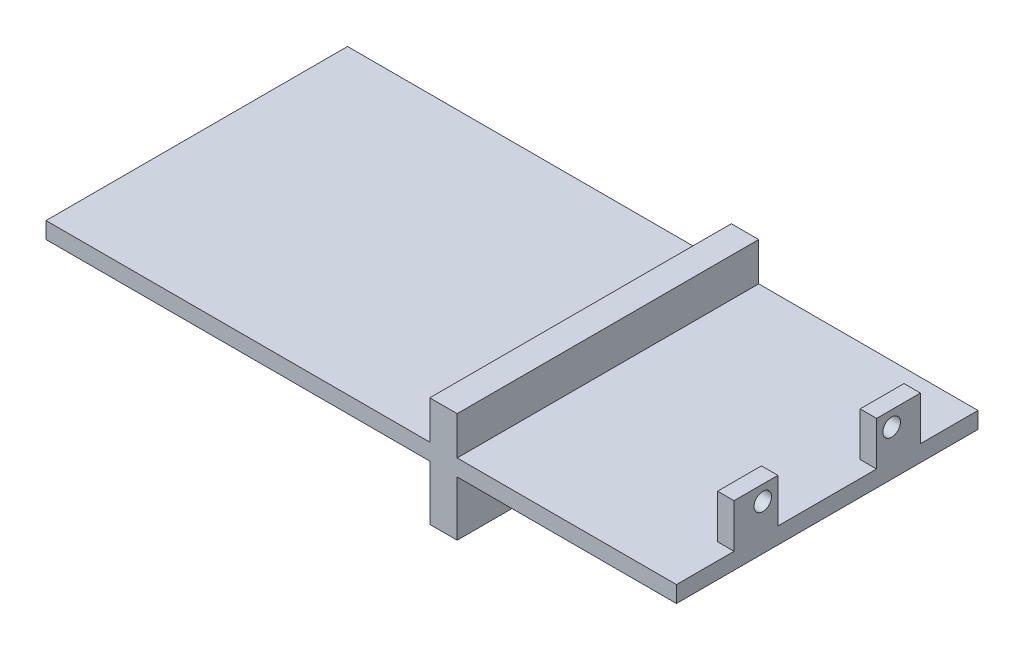
ISO-10303-21;
HEADER;
FILE_DESCRIPTION(('STEP AP214'),'2;1');
FILE_NAME('part.step','',(''),(''),'','','');
FILE_SCHEMA(('AUTOMOTIVE_DESIGN { 1 0 10303 214 1 1 1 1 }'));
ENDSEC;
DATA;
#1=APPLICATION_CONTEXT('core data for automotive mechanical design processes');
#2=APPLICATION_PROTOCOL_DEFINITION('international standard','automotive_design',2000,#1);
#3=PRODUCT_CONTEXT('',#1,'mechanical');
#4=PRODUCT('Part','Part','',(#3));
#5=PRODUCT_RELATED_PRODUCT_CATEGORY('part','',(#4));
#6=PRODUCT_DEFINITION_FORMATION('','',#4);
#7=PRODUCT_DEFINITION_CONTEXT('part definition',#1,'design');
#8=PRODUCT_DEFINITION('design','',#6,#7);
#9=PRODUCT_DEFINITION_SHAPE('','',#8);
#10=(LENGTH_UNIT() NAMED_UNIT(*) SI_UNIT(.MILLI.,.METRE.));
#11=(NAMED_UNIT(*) PLANE_ANGLE_UNIT() SI_UNIT($,.RADIAN.));
#12=(NAMED_UNIT(*) SI_UNIT($,.STERADIAN.) SOLID_ANGLE_UNIT());
#13=UNCERTAINTY_MEASURE_WITH_UNIT(LENGTH_MEASURE(1.E-05),#10,'distance_accuracy_value','');
#14=(GEOMETRIC_REPRESENTATION_CONTEXT(3) GLOBAL_UNCERTAINTY_ASSIGNED_CONTEXT((#13)) GLOBAL_UNIT_ASSIGNED_CONTEXT((#10,
#11,#12)) REPRESENTATION_CONTEXT('',''));
#15=CARTESIAN_POINT('',(0.,0.,0.));
#16=DIRECTION('',(0.,0.,1.));
#17=DIRECTION('',(1.,0.,0.));
#18=AXIS2_PLACEMENT_3D('',#15,#16,#17);
#19=CARTESIAN_POINT('',(0.,3.,0.));
#20=DIRECTION('',(0.,1.,0.));
#21=DIRECTION('',(0.,0.,1.));
#22=AXIS2_PLACEMENT_3D('',#19,#20,#21);
#23=PLANE('',#22);
#24=DIRECTION('',(0.,0.,-1.));
#25=VECTOR('',#24,1.);
#26=CARTESIAN_POINT('',(81.4545454545454,3.,0.));
#27=LINE('',#26,#25);
#28=CARTESIAN_POINT('',(81.4545454545454,3.,7.95454545454546));
#29=VERTEX_POINT('',#28);
#30=CARTESIAN_POINT('',(81.4545454545454,3.,-0.0454545454545447));
#31=VERTEX_POINT('',#30);
#32=EDGE_CURVE('E204',#29,#31,#27,.T.);
#33=ORIENTED_EDGE('',*,*,#32,.T.);
#34=DIRECTION('',(1.,0.,0.));
#35=VECTOR('',#34,1.);
#36=CARTESIAN_POINT('',(0.,3.,-0.0454545454544976));
#37=LINE('',#36,#35);
#38=CARTESIAN_POINT('',(84.4545454545455,3.,-0.0454545454545464));
#39=VERTEX_POINT('',#38);
#40=EDGE_CURVE('E211',#31,#39,#37,.T.);
#41=ORIENTED_EDGE('',*,*,#40,.T.);
#42=DIRECTION('',(0.,0.,-1.));
#43=VECTOR('',#42,1.);
#44=CARTESIAN_POINT('',(84.4545454545454,3.,-36.5454545454545));
#45=LINE('',#44,#43);
#46=CARTESIAN_POINT('',(84.4545454545455,3.,-18.0454545454545));
#47=VERTEX_POINT('',#46);
#48=EDGE_CURVE('E200',#39,#47,#45,.T.);
#49=ORIENTED_EDGE('',*,*,#48,.T.);
#50=DIRECTION('',(-1.,0.,0.));
#51=VECTOR('',#50,1.);
#52=CARTESIAN_POINT('',(0.,3.,-18.0454545454546));
#53=LINE('',#52,#51);
#54=CARTESIAN_POINT('',(81.4545454545455,3.,-18.0454545454546));
#55=VERTEX_POINT('',#54);
#56=EDGE_CURVE('E230',#47,#55,#53,.T.);
#57=ORIENTED_EDGE('',*,*,#56,.T.);
#58=DIRECTION('',(0.,0.,-1.));
#59=VECTOR('',#58,1.);
#60=CARTESIAN_POINT('',(81.4545454545455,3.,-1.4130111222502E-13));
#61=LINE('',#60,#59);
#62=CARTESIAN_POINT('',(81.4545454545454,3.,-26.0454545454545));
#63=VERTEX_POINT('',#62);
#64=EDGE_CURVE('E233',#55,#63,#61,.T.);
#65=ORIENTED_EDGE('',*,*,#64,.T.);
#66=DIRECTION('',(1.,0.,0.));
#67=VECTOR('',#66,1.);
#68=CARTESIAN_POINT('',(0.,3.,-26.0454545454546));
#69=LINE('',#68,#67);
#70=CARTESIAN_POINT('',(84.4545454545455,3.,-26.0454545454545));
#71=VERTEX_POINT('',#70);
#72=EDGE_CURVE('E236',#63,#71,#69,.T.);
#73=ORIENTED_EDGE('',*,*,#72,.T.);
#74=CARTESIAN_POINT('',(84.4545454545454,3.,-36.5454545454545));
#75=VERTEX_POINT('',#74);
#76=EDGE_CURVE('E246',#71,#75,#45,.T.);
#77=ORIENTED_EDGE('',*,*,#76,.T.);
#78=DIRECTION('',(-1.,0.,0.));
#79=VECTOR('',#78,1.);
#80=CARTESIAN_POINT('',(44.4545454545454,3.,-36.5454545454545));
#81=LINE('',#80,#79);
#82=CARTESIAN_POINT('',(44.4545454545454,3.,-36.5454545454545));
#83=VERTEX_POINT('',#82);
#84=EDGE_CURVE('E250',#75,#83,#81,.T.);
#85=ORIENTED_EDGE('',*,*,#84,.T.);
#86=DIRECTION('',(0.,0.,1.));
#87=VECTOR('',#86,1.);
#88=CARTESIAN_POINT('',(44.4545454545454,3.,-36.5454545454545));
#89=LINE('',#88,#87);
#90=CARTESIAN_POINT('',(44.4545454545454,3.,18.4545454545455));
#91=VERTEX_POINT('',#90);
#92=EDGE_CURVE('E240',#83,#91,#89,.T.);
#93=ORIENTED_EDGE('',*,*,#92,.T.);
#94=DIRECTION('',(1.,0.,0.));
#95=VECTOR('',#94,1.);
#96=CARTESIAN_POINT('',(44.4545454545454,3.,18.4545454545455));
#97=LINE('',#96,#95);
#98=CARTESIAN_POINT('',(84.4545454545455,3.,18.4545454545455));
#99=VERTEX_POINT('',#98);
#100=EDGE_CURVE('E243',#91,#99,#97,.T.);
#101=ORIENTED_EDGE('',*,*,#100,.T.);
#102=CARTESIAN_POINT('',(84.4545454545455,3.,7.95454545454546));
#103=VERTEX_POINT('',#102);
#104=EDGE_CURVE('E247',#99,#103,#45,.T.);
#105=ORIENTED_EDGE('',*,*,#104,.T.);
#106=DIRECTION('',(-1.,0.,0.));
#107=VECTOR('',#106,1.);
#108=CARTESIAN_POINT('',(0.,3.,7.95454545454541));
#109=LINE('',#108,#107);
#110=EDGE_CURVE('E201',#103,#29,#109,.T.);
#111=ORIENTED_EDGE('',*,*,#110,.T.);
#112=EDGE_LOOP('',(#33,#41,#49,#57,#65,#73,#77,#85,#93,#101,#105,#111));
#113=FACE_BOUND('',#112,.T.);
#114=ADVANCED_FACE('F37',(#113),#23,.T.);
#115=CARTESIAN_POINT('',(44.4545454545454,-10.,-36.5454545454545));
#116=DIRECTION('',(1.,0.,0.));
#117=DIRECTION('',(0.,0.,-1.));
#118=AXIS2_PLACEMENT_3D('',#115,#116,#117);
#119=PLANE('',#118);
#120=DIRECTION('',(0.,1.,0.));
#121=VECTOR('',#120,1.);
#122=CARTESIAN_POINT('',(44.4545454545454,-10.,-36.5454545454545));
#123=LINE('',#122,#121);
#124=CARTESIAN_POINT('',(44.4545454545454,-10.,-36.5454545454545));
#125=VERTEX_POINT('',#124);
#126=CARTESIAN_POINT('',(44.4545454545454,0.,-36.5454545454545));
#127=VERTEX_POINT('',#126);
#128=EDGE_CURVE('E296',#125,#127,#123,.T.);
#129=ORIENTED_EDGE('',*,*,#128,.T.);
#130=DIRECTION('',(0.,0.,1.));
#131=VECTOR('',#130,1.);
#132=CARTESIAN_POINT('',(44.4545454545454,0.,-36.5454545454545));
#133=LINE('',#132,#131);
#134=CARTESIAN_POINT('',(44.4545454545454,0.,18.4545454545455));
#135=VERTEX_POINT('',#134);
#136=EDGE_CURVE('E239',#127,#135,#133,.T.);
#137=ORIENTED_EDGE('',*,*,#136,.T.);
#138=DIRECTION('',(0.,1.,0.));
#139=VECTOR('',#138,1.);
#140=CARTESIAN_POINT('',(44.4545454545454,-10.,18.4545454545455));
#141=LINE('',#140,#139);
#142=CARTESIAN_POINT('',(44.4545454545454,-10.,18.4545454545455));
#143=VERTEX_POINT('',#142);
#144=EDGE_CURVE('E299',#143,#135,#141,.T.);
#145=ORIENTED_EDGE('',*,*,#144,.F.);
#146=DIRECTION('',(0.,0.,-1.));
#147=VECTOR('',#146,1.);
#148=CARTESIAN_POINT('',(44.4545454545454,-10.,-36.5454545454545));
#149=LINE('',#148,#147);
#150=EDGE_CURVE('E284',#143,#125,#149,.T.);
#151=ORIENTED_EDGE('',*,*,#150,.T.);
#152=EDGE_LOOP('',(#129,#137,#145,#151));
#153=FACE_BOUND('',#152,.T.);
#154=ADVANCED_FACE('F383',(#153),#119,.T.);
#155=CARTESIAN_POINT('',(0.,3.,-36.5454545454545));
#156=DIRECTION('',(0.,0.,-1.));
#157=DIRECTION('',(-1.,0.,0.));
#158=AXIS2_PLACEMENT_3D('',#155,#156,#157);
#159=PLANE('',#158);
#160=DIRECTION('',(1.,0.,0.));
#161=VECTOR('',#160,1.);
#162=CARTESIAN_POINT('',(0.,0.,-36.5454545454545));
#163=LINE('',#162,#161);
#164=CARTESIAN_POINT('',(-30.5454545454546,0.,-36.5454545454545));
#165=VERTEX_POINT('',#164);
#166=CARTESIAN_POINT('',(39.4545454545454,0.,-36.5454545454545));
#167=VERTEX_POINT('',#166);
#168=EDGE_CURVE('E319',#165,#167,#163,.T.);
#169=ORIENTED_EDGE('',*,*,#168,.F.);
#170=DIRECTION('',(0.,-1.,0.));
#171=VECTOR('',#170,1.);
#172=CARTESIAN_POINT('',(-30.5454545454546,3.,-36.5454545454545));
#173=LINE('',#172,#171);
#174=CARTESIAN_POINT('',(-30.5454545454546,3.,-36.5454545454545));
#175=VERTEX_POINT('',#174);
#176=EDGE_CURVE('E11',#175,#165,#173,.T.);
#177=ORIENTED_EDGE('',*,*,#176,.F.);
#178=DIRECTION('',(1.,0.,0.));
#179=VECTOR('',#178,1.);
#180=CARTESIAN_POINT('',(0.,3.,-36.5454545454545));
#181=LINE('',#180,#179);
#182=CARTESIAN_POINT('',(39.4545454545454,3.,-36.5454545454545));
#183=VERTEX_POINT('',#182);
#184=EDGE_CURVE('E309',#175,#183,#181,.T.);
#185=ORIENTED_EDGE('',*,*,#184,.T.);
#186=DIRECTION('',(0.,1.,0.));
#187=VECTOR('',#186,1.);
#188=CARTESIAN_POINT('',(39.4545454545454,-10.,-36.5454545454545));
#189=LINE('',#188,#187);
#190=CARTESIAN_POINT('',(39.4545454545454,10.,-36.5454545454545));
#191=VERTEX_POINT('',#190);
#192=EDGE_CURVE('E295',#183,#191,#189,.T.);
#193=ORIENTED_EDGE('',*,*,#192,.T.);
#194=DIRECTION('',(-1.,0.,0.));
#195=VECTOR('',#194,1.);
#196=CARTESIAN_POINT('',(39.4545454545454,10.,-36.5454545454545));
#197=LINE('',#196,#195);
#198=CARTESIAN_POINT('',(44.4545454545454,10.,-36.5454545454545));
#199=VERTEX_POINT('',#198);
#200=EDGE_CURVE('E275',#199,#191,#197,.T.);
#201=ORIENTED_EDGE('',*,*,#200,.F.);
#202=EDGE_CURVE('E298',#83,#199,#123,.T.);
#203=ORIENTED_EDGE('',*,*,#202,.F.);
#204=ORIENTED_EDGE('',*,*,#84,.F.);
#205=DIRECTION('',(0.,-1.,0.));
#206=VECTOR('',#205,1.);
#207=CARTESIAN_POINT('',(84.4545454545454,3.,-36.5454545454545));
#208=LINE('',#207,#206);
#209=CARTESIAN_POINT('',(84.4545454545454,0.,-36.5454545454545));
#210=VERTEX_POINT('',#209);
#211=EDGE_CURVE('E253',#75,#210,#208,.T.);
#212=ORIENTED_EDGE('',*,*,#211,.T.);
#213=DIRECTION('',(-1.,0.,0.));
#214=VECTOR('',#213,1.);
#215=CARTESIAN_POINT('',(44.4545454545454,0.,-36.5454545454545));
#216=LINE('',#215,#214);
#217=EDGE_CURVE('E244',#210,#127,#216,.T.);
#218=ORIENTED_EDGE('',*,*,#217,.T.);
#219=ORIENTED_EDGE('',*,*,#128,.F.);
#220=DIRECTION('',(-1.,0.,0.));
#221=VECTOR('',#220,1.);
#222=CARTESIAN_POINT('',(39.4545454545454,-10.,-36.5454545454545));
#223=LINE('',#222,#221);
#224=CARTESIAN_POINT('',(39.4545454545454,-10.,-36.5454545454545));
#225=VERTEX_POINT('',#224);
#226=EDGE_CURVE('E287',#125,#225,#223,.T.);
#227=ORIENTED_EDGE('',*,*,#226,.T.);
#228=EDGE_CURVE('E291',#225,#167,#189,.T.);
#229=ORIENTED_EDGE('',*,*,#228,.T.);
#230=EDGE_LOOP('',(#169,#177,#185,#193,#201,#203,#204,#212,#218,#219,#227,#229));
#231=FACE_BOUND('',#230,.T.);
#232=ADVANCED_FACE('F39',(#231),#159,.T.);
#233=CARTESIAN_POINT('',(-30.5454545454546,3.,0.));
#234=DIRECTION('',(1.,0.,0.));
#235=DIRECTION('',(0.,0.,-1.));
#236=AXIS2_PLACEMENT_3D('',#233,#234,#235);
#237=PLANE('',#236);
#238=DIRECTION('',(0.,0.,1.));
#239=VECTOR('',#238,1.);
#240=CARTESIAN_POINT('',(-30.5454545454546,0.,0.));
#241=LINE('',#240,#239);
#242=CARTESIAN_POINT('',(-30.5454545454546,0.,18.4545454545455));
#243=VERTEX_POINT('',#242);
#244=EDGE_CURVE('E321',#165,#243,#241,.T.);
#245=ORIENTED_EDGE('',*,*,#244,.T.);
#246=DIRECTION('',(0.,-1.,0.));
#247=VECTOR('',#246,1.);
#248=CARTESIAN_POINT('',(-30.5454545454546,3.,18.4545454545455));
#249=LINE('',#248,#247);
#250=CARTESIAN_POINT('',(-30.5454545454546,3.,18.4545454545455));
#251=VERTEX_POINT('',#250);
#252=EDGE_CURVE('E46',#251,#243,#249,.T.);
#253=ORIENTED_EDGE('',*,*,#252,.F.);
#254=DIRECTION('',(0.,0.,1.));
#255=VECTOR('',#254,1.);
#256=CARTESIAN_POINT('',(-30.5454545454546,3.,0.));
#257=LINE('',#256,#255);
#258=EDGE_CURVE('E313',#175,#251,#257,.T.);
#259=ORIENTED_EDGE('',*,*,#258,.F.);
#260=ORIENTED_EDGE('',*,*,#176,.T.);
#261=EDGE_LOOP('',(#245,#253,#259,#260));
#262=FACE_BOUND('',#261,.T.);
#263=ADVANCED_FACE('F418',(#262),#237,.F.);
#264=CARTESIAN_POINT('',(0.,3.,18.4545454545455));
#265=DIRECTION('',(0.,0.,-1.));
#266=DIRECTION('',(-1.,0.,0.));
#267=AXIS2_PLACEMENT_3D('',#264,#265,#266);
#268=PLANE('',#267);
#269=DIRECTION('',(1.,0.,0.));
#270=VECTOR('',#269,1.);
#271=CARTESIAN_POINT('',(0.,0.,18.4545454545455));
#272=LINE('',#271,#270);
#273=CARTESIAN_POINT('',(39.4545454545454,0.,18.4545454545455));
#274=VERTEX_POINT('',#273);
#275=EDGE_CURVE('E310',#243,#274,#272,.T.);
#276=ORIENTED_EDGE('',*,*,#275,.T.);
#277=DIRECTION('',(0.,1.,0.));
#278=VECTOR('',#277,1.);
#279=CARTESIAN_POINT('',(39.4545454545454,-10.,18.4545454545455));
#280=LINE('',#279,#278);
#281=CARTESIAN_POINT('',(39.4545454545454,-10.,18.4545454545455));
#282=VERTEX_POINT('',#281);
#283=EDGE_CURVE('E303',#282,#274,#280,.T.);
#284=ORIENTED_EDGE('',*,*,#283,.F.);
#285=DIRECTION('',(1.,0.,0.));
#286=VECTOR('',#285,1.);
#287=CARTESIAN_POINT('',(39.4545454545454,-10.,18.4545454545455));
#288=LINE('',#287,#286);
#289=EDGE_CURVE('E281',#282,#143,#288,.T.);
#290=ORIENTED_EDGE('',*,*,#289,.T.);
#291=ORIENTED_EDGE('',*,*,#144,.T.);
#292=DIRECTION('',(1.,0.,0.));
#293=VECTOR('',#292,1.);
#294=CARTESIAN_POINT('',(44.4545454545454,0.,18.4545454545455));
#295=LINE('',#294,#293);
#296=CARTESIAN_POINT('',(84.4545454545455,0.,18.4545454545455));
#297=VERTEX_POINT('',#296);
#298=EDGE_CURVE('E255',#135,#297,#295,.T.);
#299=ORIENTED_EDGE('',*,*,#298,.T.);
#300=DIRECTION('',(0.,-1.,0.));
#301=VECTOR('',#300,1.);
#302=CARTESIAN_POINT('',(84.4545454545455,3.,18.4545454545455));
#303=LINE('',#302,#301);
#304=EDGE_CURVE('E263',#99,#297,#303,.T.);
#305=ORIENTED_EDGE('',*,*,#304,.F.);
#306=ORIENTED_EDGE('',*,*,#100,.F.);
#307=CARTESIAN_POINT('',(44.4545454545454,10.,18.4545454545455));
#308=VERTEX_POINT('',#307);
#309=EDGE_CURVE('E302',#91,#308,#141,.T.);
#310=ORIENTED_EDGE('',*,*,#309,.T.);
#311=DIRECTION('',(1.,0.,0.));
#312=VECTOR('',#311,1.);
#313=CARTESIAN_POINT('',(39.4545454545454,10.,18.4545454545455));
#314=LINE('',#313,#312);
#315=CARTESIAN_POINT('',(39.4545454545454,10.,18.4545454545455));
#316=VERTEX_POINT('',#315);
#317=EDGE_CURVE('E269',#316,#308,#314,.T.);
#318=ORIENTED_EDGE('',*,*,#317,.F.);
#319=CARTESIAN_POINT('',(39.4545454545454,3.,18.4545454545455));
#320=VERTEX_POINT('',#319);
#321=EDGE_CURVE('E290',#320,#316,#280,.T.);
#322=ORIENTED_EDGE('',*,*,#321,.F.);
#323=DIRECTION('',(1.,0.,0.));
#324=VECTOR('',#323,1.);
#325=CARTESIAN_POINT('',(0.,3.,18.4545454545455));
#326=LINE('',#325,#324);
#327=EDGE_CURVE('E315',#251,#320,#326,.T.);
#328=ORIENTED_EDGE('',*,*,#327,.F.);
#329=ORIENTED_EDGE('',*,*,#252,.T.);
#330=EDGE_LOOP('',(#276,#284,#290,#291,#299,#305,#306,#310,#318,#322,#328,#329));
#331=FACE_BOUND('',#330,.T.);
#332=ADVANCED_FACE('F347',(#331),#268,.F.);
#333=CARTESIAN_POINT('',(0.,3.,0.));
#334=DIRECTION('',(0.,1.,0.));
#335=DIRECTION('',(0.,0.,1.));
#336=AXIS2_PLACEMENT_3D('',#333,#334,#335);
#337=PLANE('',#336);
#338=DIRECTION('',(0.,0.,1.));
#339=VECTOR('',#338,1.);
#340=CARTESIAN_POINT('',(39.4545454545454,3.,0.));
#341=LINE('',#340,#339);
#342=EDGE_CURVE('E306',#183,#320,#341,.T.);
#343=ORIENTED_EDGE('',*,*,#342,.F.);
#344=ORIENTED_EDGE('',*,*,#184,.F.);
#345=ORIENTED_EDGE('',*,*,#258,.T.);
#346=ORIENTED_EDGE('',*,*,#327,.T.);
#347=EDGE_LOOP('',(#343,#344,#345,#346));
#348=FACE_BOUND('',#347,.T.);
#349=ADVANCED_FACE('F409',(#348),#337,.T.);
#350=CARTESIAN_POINT('',(0.,0.,0.));
#351=DIRECTION('',(0.,1.,0.));
#352=DIRECTION('',(0.,0.,1.));
#353=AXIS2_PLACEMENT_3D('',#350,#351,#352);
#354=PLANE('',#353);
#355=DIRECTION('',(0.,0.,1.));
#356=VECTOR('',#355,1.);
#357=CARTESIAN_POINT('',(39.4545454545454,0.,0.));
#358=LINE('',#357,#356);
#359=EDGE_CURVE('E294',#167,#274,#358,.T.);
#360=ORIENTED_EDGE('',*,*,#359,.T.);
#361=ORIENTED_EDGE('',*,*,#275,.F.);
#362=ORIENTED_EDGE('',*,*,#244,.F.);
#363=ORIENTED_EDGE('',*,*,#168,.T.);
#364=EDGE_LOOP('',(#360,#361,#362,#363));
#365=FACE_BOUND('',#364,.T.);
#366=ADVANCED_FACE('F412',(#365),#354,.F.);
#367=CARTESIAN_POINT('',(39.4545454545454,-10.,-36.5454545454545));
#368=DIRECTION('',(-1.,0.,0.));
#369=DIRECTION('',(0.,0.,1.));
#370=AXIS2_PLACEMENT_3D('',#367,#368,#369);
#371=PLANE('',#370);
#372=ORIENTED_EDGE('',*,*,#359,.F.);
#373=ORIENTED_EDGE('',*,*,#228,.F.);
#374=DIRECTION('',(0.,0.,1.));
#375=VECTOR('',#374,1.);
#376=CARTESIAN_POINT('',(39.4545454545454,-10.,-36.5454545454545));
#377=LINE('',#376,#375);
#378=EDGE_CURVE('E278',#225,#282,#377,.T.);
#379=ORIENTED_EDGE('',*,*,#378,.T.);
#380=ORIENTED_EDGE('',*,*,#283,.T.);
#381=EDGE_LOOP('',(#372,#373,#379,#380));
#382=FACE_BOUND('',#381,.T.);
#383=ADVANCED_FACE('F407',(#382),#371,.T.);
#384=ORIENTED_EDGE('',*,*,#192,.F.);
#385=ORIENTED_EDGE('',*,*,#342,.T.);
#386=ORIENTED_EDGE('',*,*,#321,.T.);
#387=DIRECTION('',(0.,0.,1.));
#388=VECTOR('',#387,1.);
#389=CARTESIAN_POINT('',(39.4545454545454,10.,-36.5454545454545));
#390=LINE('',#389,#388);
#391=EDGE_CURVE('E266',#191,#316,#390,.T.);
#392=ORIENTED_EDGE('',*,*,#391,.F.);
#393=EDGE_LOOP('',(#384,#385,#386,#392));
#394=FACE_BOUND('',#393,.T.);
#395=ADVANCED_FACE('F403',(#394),#371,.T.);
#396=ORIENTED_EDGE('',*,*,#92,.F.);
#397=ORIENTED_EDGE('',*,*,#202,.T.);
#398=DIRECTION('',(0.,0.,-1.));
#399=VECTOR('',#398,1.);
#400=CARTESIAN_POINT('',(44.4545454545454,10.,-36.5454545454545));
#401=LINE('',#400,#399);
#402=EDGE_CURVE('E272',#308,#199,#401,.T.);
#403=ORIENTED_EDGE('',*,*,#402,.F.);
#404=ORIENTED_EDGE('',*,*,#309,.F.);
#405=EDGE_LOOP('',(#396,#397,#403,#404));
#406=FACE_BOUND('',#405,.T.);
#407=ADVANCED_FACE('F389',(#406),#119,.T.);
#408=CARTESIAN_POINT('',(0.,-10.,0.));
#409=DIRECTION('',(0.,1.,0.));
#410=DIRECTION('',(0.,0.,1.));
#411=AXIS2_PLACEMENT_3D('',#408,#409,#410);
#412=PLANE('',#411);
#413=ORIENTED_EDGE('',*,*,#378,.F.);
#414=ORIENTED_EDGE('',*,*,#226,.F.);
#415=ORIENTED_EDGE('',*,*,#150,.F.);
#416=ORIENTED_EDGE('',*,*,#289,.F.);
#417=EDGE_LOOP('',(#413,#414,#415,#416));
#418=FACE_BOUND('',#417,.T.);
#419=ADVANCED_FACE('F397',(#418),#412,.F.);
#420=CARTESIAN_POINT('',(0.,10.,0.));
#421=DIRECTION('',(0.,1.,0.));
#422=DIRECTION('',(0.,0.,1.));
#423=AXIS2_PLACEMENT_3D('',#420,#421,#422);
#424=PLANE('',#423);
#425=ORIENTED_EDGE('',*,*,#391,.T.);
#426=ORIENTED_EDGE('',*,*,#317,.T.);
#427=ORIENTED_EDGE('',*,*,#402,.T.);
#428=ORIENTED_EDGE('',*,*,#200,.T.);
#429=EDGE_LOOP('',(#425,#426,#427,#428));
#430=FACE_BOUND('',#429,.T.);
#431=ADVANCED_FACE('F393',(#430),#424,.T.);
#432=CARTESIAN_POINT('',(84.4545454545454,3.,-36.5454545454545));
#433=DIRECTION('',(-1.,0.,0.));
#434=DIRECTION('',(0.,0.,1.));
#435=AXIS2_PLACEMENT_3D('',#432,#433,#434);
#436=PLANE('',#435);
#437=CARTESIAN_POINT('',(84.4545454545455,8.25,2.70454545454545));
#438=DIRECTION('',(1.,0.,0.));
#439=DIRECTION('',(0.,0.,-1.));
#440=AXIS2_PLACEMENT_3D('',#437,#438,#439);
#441=CIRCLE('',#440,1.6);
#442=CARTESIAN_POINT('',(84.4545454545455,8.25,1.10454545454545));
#443=VERTEX_POINT('',#442);
#444=EDGE_CURVE('E327',#443,#443,#441,.T.);
#445=ORIENTED_EDGE('',*,*,#444,.F.);
#446=EDGE_LOOP('',(#445));
#447=FACE_BOUND('',#446,.T.);
#448=CARTESIAN_POINT('',(84.4545454545455,8.25,-20.7954545454545));
#449=DIRECTION('',(1.,0.,0.));
#450=DIRECTION('',(0.,0.,-1.));
#451=AXIS2_PLACEMENT_3D('',#448,#449,#450);
#452=CIRCLE('',#451,1.6);
#453=CARTESIAN_POINT('',(84.4545454545455,8.25,-22.3954545454545));
#454=VERTEX_POINT('',#453);
#455=EDGE_CURVE('E332',#454,#454,#452,.T.);
#456=ORIENTED_EDGE('',*,*,#455,.F.);
#457=EDGE_LOOP('',(#456));
#458=FACE_BOUND('',#457,.T.);
#459=DIRECTION('',(0.,0.,-1.));
#460=VECTOR('',#459,1.);
#461=CARTESIAN_POINT('',(84.4545454545454,0.,-36.5454545454545));
#462=LINE('',#461,#460);
#463=EDGE_CURVE('E257',#297,#210,#462,.T.);
#464=ORIENTED_EDGE('',*,*,#463,.T.);
#465=ORIENTED_EDGE('',*,*,#211,.F.);
#466=ORIENTED_EDGE('',*,*,#76,.F.);
#467=DIRECTION('',(0.,-1.,0.));
#468=VECTOR('',#467,1.);
#469=CARTESIAN_POINT('',(84.4545454545455,11.,-26.0454545454545));
#470=LINE('',#469,#468);
#471=CARTESIAN_POINT('',(84.4545454545455,11.,-26.0454545454545));
#472=VERTEX_POINT('',#471);
#473=EDGE_CURVE('E228',#472,#71,#470,.T.);
#474=ORIENTED_EDGE('',*,*,#473,.F.);
#475=DIRECTION('',(0.,0.,-1.));
#476=VECTOR('',#475,1.);
#477=CARTESIAN_POINT('',(84.4545454545455,11.,-26.0454545454545));
#478=LINE('',#477,#476);
#479=CARTESIAN_POINT('',(84.4545454545455,11.,-18.0454545454545));
#480=VERTEX_POINT('',#479);
#481=EDGE_CURVE('E213',#480,#472,#478,.T.);
#482=ORIENTED_EDGE('',*,*,#481,.F.);
#483=DIRECTION('',(0.,-1.,0.));
#484=VECTOR('',#483,1.);
#485=CARTESIAN_POINT('',(84.4545454545455,11.,-18.0454545454545));
#486=LINE('',#485,#484);
#487=EDGE_CURVE('E222',#480,#47,#486,.T.);
#488=ORIENTED_EDGE('',*,*,#487,.T.);
#489=ORIENTED_EDGE('',*,*,#48,.F.);
#490=DIRECTION('',(0.,-1.,0.));
#491=VECTOR('',#490,1.);
#492=CARTESIAN_POINT('',(84.4545454545455,11.,-0.0454545454545464));
#493=LINE('',#492,#491);
#494=CARTESIAN_POINT('',(84.4545454545455,11.,-0.0454545454545464));
#495=VERTEX_POINT('',#494);
#496=EDGE_CURVE('E181',#495,#39,#493,.T.);
#497=ORIENTED_EDGE('',*,*,#496,.F.);
#498=DIRECTION('',(0.,0.,-1.));
#499=VECTOR('',#498,1.);
#500=CARTESIAN_POINT('',(84.4545454545455,11.,-0.0454545454545464));
#501=LINE('',#500,#499);
#502=CARTESIAN_POINT('',(84.4545454545455,11.,7.95454545454546));
#503=VERTEX_POINT('',#502);
#504=EDGE_CURVE('E188',#503,#495,#501,.T.);
#505=ORIENTED_EDGE('',*,*,#504,.F.);
#506=DIRECTION('',(0.,-1.,0.));
#507=VECTOR('',#506,1.);
#508=CARTESIAN_POINT('',(84.4545454545455,11.,7.95454545454546));
#509=LINE('',#508,#507);
#510=EDGE_CURVE('E341',#503,#103,#509,.T.);
#511=ORIENTED_EDGE('',*,*,#510,.T.);
#512=ORIENTED_EDGE('',*,*,#104,.F.);
#513=ORIENTED_EDGE('',*,*,#304,.T.);
#514=EDGE_LOOP('',(#464,#465,#466,#474,#482,#488,#489,#497,#505,#511,#512,#513));
#515=FACE_BOUND('',#514,.T.);
#516=ADVANCED_FACE('F198',(#447,#458,#515),#436,.F.);
#517=CARTESIAN_POINT('',(0.,0.,0.));
#518=DIRECTION('',(0.,1.,0.));
#519=DIRECTION('',(0.,0.,1.));
#520=AXIS2_PLACEMENT_3D('',#517,#518,#519);
#521=PLANE('',#520);
#522=ORIENTED_EDGE('',*,*,#217,.F.);
#523=ORIENTED_EDGE('',*,*,#463,.F.);
#524=ORIENTED_EDGE('',*,*,#298,.F.);
#525=ORIENTED_EDGE('',*,*,#136,.F.);
#526=EDGE_LOOP('',(#522,#523,#524,#525));
#527=FACE_BOUND('',#526,.T.);
#528=ADVANCED_FACE('F353',(#527),#521,.F.);
#529=CARTESIAN_POINT('',(84.4545454545455,11.,-26.0454545454545));
#530=DIRECTION('',(0.,0.,1.));
#531=DIRECTION('',(1.,0.,0.));
#532=AXIS2_PLACEMENT_3D('',#529,#530,#531);
#533=PLANE('',#532);
#534=ORIENTED_EDGE('',*,*,#72,.F.);
#535=DIRECTION('',(0.,-1.,0.));
#536=VECTOR('',#535,1.);
#537=CARTESIAN_POINT('',(81.4545454545454,11.,-26.0454545454545));
#538=LINE('',#537,#536);
#539=CARTESIAN_POINT('',(81.4545454545454,11.,-26.0454545454545));
#540=VERTEX_POINT('',#539);
#541=EDGE_CURVE('E225',#540,#63,#538,.T.);
#542=ORIENTED_EDGE('',*,*,#541,.F.);
#543=DIRECTION('',(-1.,0.,0.));
#544=VECTOR('',#543,1.);
#545=CARTESIAN_POINT('',(84.4545454545455,11.,-26.0454545454545));
#546=LINE('',#545,#544);
#547=EDGE_CURVE('E216',#472,#540,#546,.T.);
#548=ORIENTED_EDGE('',*,*,#547,.F.);
#549=ORIENTED_EDGE('',*,*,#473,.T.);
#550=EDGE_LOOP('',(#534,#542,#548,#549));
#551=FACE_BOUND('',#550,.T.);
#552=ADVANCED_FACE('F371',(#551),#533,.F.);
#553=CARTESIAN_POINT('',(81.4545454545454,11.,-26.0454545454545));
#554=DIRECTION('',(1.,0.,0.));
#555=DIRECTION('',(0.,0.,-1.));
#556=AXIS2_PLACEMENT_3D('',#553,#554,#555);
#557=PLANE('',#556);
#558=CARTESIAN_POINT('',(81.4545454545455,8.25,-20.7954545454545));
#559=DIRECTION('',(1.,0.,0.));
#560=DIRECTION('',(0.,0.,-1.));
#561=AXIS2_PLACEMENT_3D('',#558,#559,#560);
#562=CIRCLE('',#561,1.6);
#563=CARTESIAN_POINT('',(81.4545454545455,8.25,-22.3954545454545));
#564=VERTEX_POINT('',#563);
#565=EDGE_CURVE('E41',#564,#564,#562,.T.);
#566=ORIENTED_EDGE('',*,*,#565,.T.);
#567=EDGE_LOOP('',(#566));
#568=FACE_BOUND('',#567,.T.);
#569=ORIENTED_EDGE('',*,*,#64,.F.);
#570=DIRECTION('',(0.,-1.,0.));
#571=VECTOR('',#570,1.);
#572=CARTESIAN_POINT('',(81.4545454545455,11.,-18.0454545454546));
#573=LINE('',#572,#571);
#574=CARTESIAN_POINT('',(81.4545454545455,11.,-18.0454545454546));
#575=VERTEX_POINT('',#574);
#576=EDGE_CURVE('E62',#575,#55,#573,.T.);
#577=ORIENTED_EDGE('',*,*,#576,.F.);
#578=DIRECTION('',(0.,0.,1.));
#579=VECTOR('',#578,1.);
#580=CARTESIAN_POINT('',(81.4545454545454,11.,-26.0454545454545));
#581=LINE('',#580,#579);
#582=EDGE_CURVE('E218',#540,#575,#581,.T.);
#583=ORIENTED_EDGE('',*,*,#582,.F.);
#584=ORIENTED_EDGE('',*,*,#541,.T.);
#585=EDGE_LOOP('',(#569,#577,#583,#584));
#586=FACE_BOUND('',#585,.T.);
#587=ADVANCED_FACE('F369',(#568,#586),#557,.F.);
#588=CARTESIAN_POINT('',(84.4545454545455,11.,-18.0454545454545));
#589=DIRECTION('',(0.,0.,-1.));
#590=DIRECTION('',(-1.,0.,0.));
#591=AXIS2_PLACEMENT_3D('',#588,#589,#590);
#592=PLANE('',#591);
#593=ORIENTED_EDGE('',*,*,#56,.F.);
#594=ORIENTED_EDGE('',*,*,#487,.F.);
#595=DIRECTION('',(1.,0.,0.));
#596=VECTOR('',#595,1.);
#597=CARTESIAN_POINT('',(84.4545454545455,11.,-18.0454545454545));
#598=LINE('',#597,#596);
#599=EDGE_CURVE('E220',#575,#480,#598,.T.);
#600=ORIENTED_EDGE('',*,*,#599,.F.);
#601=ORIENTED_EDGE('',*,*,#576,.T.);
#602=EDGE_LOOP('',(#593,#594,#600,#601));
#603=FACE_BOUND('',#602,.T.);
#604=ADVANCED_FACE('F363',(#603),#592,.F.);
#605=CARTESIAN_POINT('',(0.,11.,0.));
#606=DIRECTION('',(0.,-1.,0.));
#607=DIRECTION('',(0.,0.,-1.));
#608=AXIS2_PLACEMENT_3D('',#605,#606,#607);
#609=PLANE('',#608);
#610=ORIENTED_EDGE('',*,*,#481,.T.);
#611=ORIENTED_EDGE('',*,*,#547,.T.);
#612=ORIENTED_EDGE('',*,*,#582,.T.);
#613=ORIENTED_EDGE('',*,*,#599,.T.);
#614=EDGE_LOOP('',(#610,#611,#612,#613));
#615=FACE_BOUND('',#614,.T.);
#616=ADVANCED_FACE('F365',(#615),#609,.F.);
#617=CARTESIAN_POINT('',(84.4545454545455,11.,-0.0454545454545464));
#618=DIRECTION('',(0.,0.,1.));
#619=DIRECTION('',(1.,0.,0.));
#620=AXIS2_PLACEMENT_3D('',#617,#618,#619);
#621=PLANE('',#620);
#622=ORIENTED_EDGE('',*,*,#40,.F.);
#623=DIRECTION('',(0.,-1.,0.));
#624=VECTOR('',#623,1.);
#625=CARTESIAN_POINT('',(81.4545454545454,11.,-0.0454545454545447));
#626=LINE('',#625,#624);
#627=CARTESIAN_POINT('',(81.4545454545454,11.,-0.0454545454545447));
#628=VERTEX_POINT('',#627);
#629=EDGE_CURVE('E184',#628,#31,#626,.T.);
#630=ORIENTED_EDGE('',*,*,#629,.F.);
#631=DIRECTION('',(-1.,0.,0.));
#632=VECTOR('',#631,1.);
#633=CARTESIAN_POINT('',(84.4545454545455,11.,-0.0454545454545464));
#634=LINE('',#633,#632);
#635=EDGE_CURVE('E177',#495,#628,#634,.T.);
#636=ORIENTED_EDGE('',*,*,#635,.F.);
#637=ORIENTED_EDGE('',*,*,#496,.T.);
#638=EDGE_LOOP('',(#622,#630,#636,#637));
#639=FACE_BOUND('',#638,.T.);
#640=ADVANCED_FACE('F179',(#639),#621,.F.);
#641=CARTESIAN_POINT('',(81.4545454545454,11.,-0.0454545454545447));
#642=DIRECTION('',(1.,0.,0.));
#643=DIRECTION('',(0.,0.,-1.));
#644=AXIS2_PLACEMENT_3D('',#641,#642,#643);
#645=PLANE('',#644);
#646=CARTESIAN_POINT('',(81.4545454545454,8.25,2.70454545454545));
#647=DIRECTION('',(1.,0.,0.));
#648=DIRECTION('',(0.,0.,-1.));
#649=AXIS2_PLACEMENT_3D('',#646,#647,#648);
#650=CIRCLE('',#649,1.6);
#651=CARTESIAN_POINT('',(81.4545454545454,8.25,1.10454545454545));
#652=VERTEX_POINT('',#651);
#653=EDGE_CURVE('E325',#652,#652,#650,.T.);
#654=ORIENTED_EDGE('',*,*,#653,.T.);
#655=EDGE_LOOP('',(#654));
#656=FACE_BOUND('',#655,.T.);
#657=ORIENTED_EDGE('',*,*,#32,.F.);
#658=DIRECTION('',(0.,-1.,0.));
#659=VECTOR('',#658,1.);
#660=CARTESIAN_POINT('',(81.4545454545454,11.,7.95454545454546));
#661=LINE('',#660,#659);
#662=CARTESIAN_POINT('',(81.4545454545454,11.,7.95454545454546));
#663=VERTEX_POINT('',#662);
#664=EDGE_CURVE('E54',#663,#29,#661,.T.);
#665=ORIENTED_EDGE('',*,*,#664,.F.);
#666=DIRECTION('',(0.,0.,1.));
#667=VECTOR('',#666,1.);
#668=CARTESIAN_POINT('',(81.4545454545454,11.,-0.0454545454545447));
#669=LINE('',#668,#667);
#670=EDGE_CURVE('E187',#628,#663,#669,.T.);
#671=ORIENTED_EDGE('',*,*,#670,.F.);
#672=ORIENTED_EDGE('',*,*,#629,.T.);
#673=EDGE_LOOP('',(#657,#665,#671,#672));
#674=FACE_BOUND('',#673,.T.);
#675=ADVANCED_FACE('F508',(#656,#674),#645,.F.);
#676=CARTESIAN_POINT('',(84.4545454545455,11.,7.95454545454546));
#677=DIRECTION('',(0.,0.,-1.));
#678=DIRECTION('',(-1.,0.,0.));
#679=AXIS2_PLACEMENT_3D('',#676,#677,#678);
#680=PLANE('',#679);
#681=ORIENTED_EDGE('',*,*,#110,.F.);
#682=ORIENTED_EDGE('',*,*,#510,.F.);
#683=DIRECTION('',(1.,0.,0.));
#684=VECTOR('',#683,1.);
#685=CARTESIAN_POINT('',(84.4545454545455,11.,7.95454545454546));
#686=LINE('',#685,#684);
#687=EDGE_CURVE('E192',#663,#503,#686,.T.);
#688=ORIENTED_EDGE('',*,*,#687,.F.);
#689=ORIENTED_EDGE('',*,*,#664,.T.);
#690=EDGE_LOOP('',(#681,#682,#688,#689));
#691=FACE_BOUND('',#690,.T.);
#692=ADVANCED_FACE('F515',(#691),#680,.F.);
#693=CARTESIAN_POINT('',(0.,11.,0.));
#694=DIRECTION('',(0.,-1.,0.));
#695=DIRECTION('',(0.,0.,-1.));
#696=AXIS2_PLACEMENT_3D('',#693,#694,#695);
#697=PLANE('',#696);
#698=ORIENTED_EDGE('',*,*,#504,.T.);
#699=ORIENTED_EDGE('',*,*,#635,.T.);
#700=ORIENTED_EDGE('',*,*,#670,.T.);
#701=ORIENTED_EDGE('',*,*,#687,.T.);
#702=EDGE_LOOP('',(#698,#699,#700,#701));
#703=FACE_BOUND('',#702,.T.);
#704=ADVANCED_FACE('F191',(#703),#697,.F.);
#705=CARTESIAN_POINT('',(73.4545454545455,8.25,2.70454545454546));
#706=DIRECTION('',(1.,0.,0.));
#707=DIRECTION('',(0.,0.,-1.));
#708=AXIS2_PLACEMENT_3D('',#705,#706,#707);
#709=CYLINDRICAL_SURFACE('',#708,1.6);
#710=ORIENTED_EDGE('',*,*,#444,.T.);
#711=EDGE_LOOP('',(#710));
#712=FACE_BOUND('',#711,.T.);
#713=ORIENTED_EDGE('',*,*,#653,.F.);
#714=EDGE_LOOP('',(#713));
#715=FACE_BOUND('',#714,.T.);
#716=ADVANCED_FACE('F526',(#712,#715),#709,.F.);
#717=CARTESIAN_POINT('',(73.4545454545455,8.25,-20.7954545454545));
#718=DIRECTION('',(1.,0.,0.));
#719=DIRECTION('',(0.,0.,-1.));
#720=AXIS2_PLACEMENT_3D('',#717,#718,#719);
#721=CYLINDRICAL_SURFACE('',#720,1.6);
#722=ORIENTED_EDGE('',*,*,#455,.T.);
#723=EDGE_LOOP('',(#722));
#724=FACE_BOUND('',#723,.T.);
#725=ORIENTED_EDGE('',*,*,#565,.F.);
#726=EDGE_LOOP('',(#725));
#727=FACE_BOUND('',#726,.T.);
#728=ADVANCED_FACE('F536',(#724,#727),#721,.F.);
#729=CLOSED_SHELL('',(#114,#154,#232,#263,#332,#349,#366,#383,#395,#407,#419,#431,#516,#528,
#552,#587,#604,#616,#640,#675,#692,#704,#716,#728));
#730=MANIFOLD_SOLID_BREP('B2',#729);
#731=ADVANCED_BREP_SHAPE_REPRESENTATION('',(#18,#730),#14);
#732=SHAPE_DEFINITION_REPRESENTATION(#9,#731);
ENDSEC;
END-ISO-10303-21;
